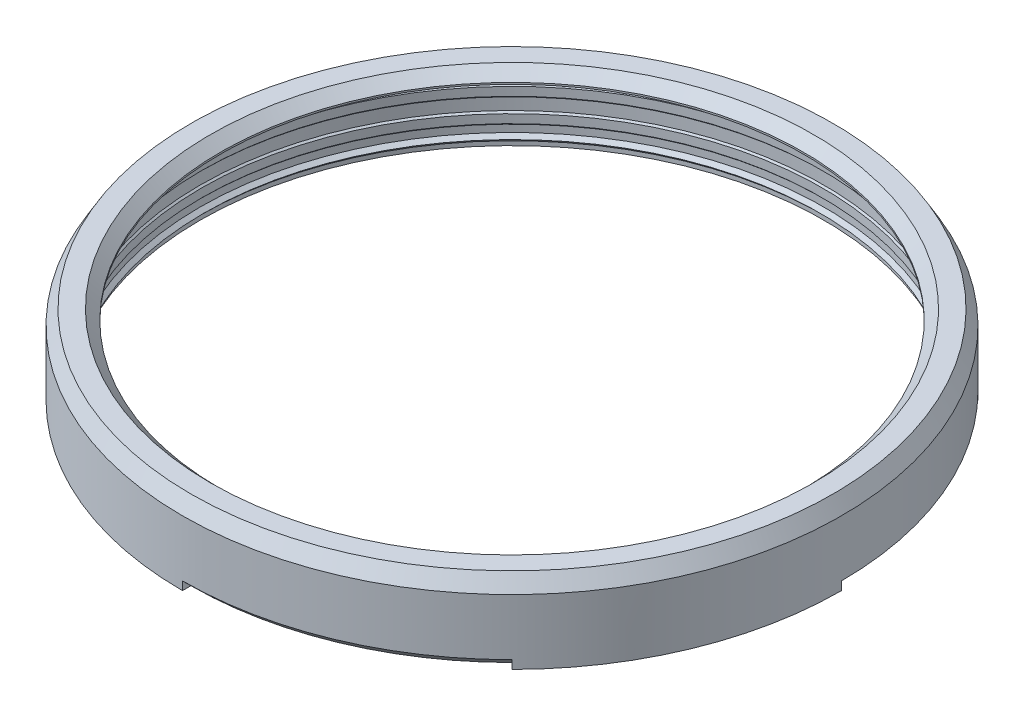
ISO-10303-21;
HEADER;
FILE_DESCRIPTION(('STEP AP214'),'2;1');
FILE_NAME('part.step','',(''),(''),'','','');
FILE_SCHEMA(('AUTOMOTIVE_DESIGN { 1 0 10303 214 1 1 1 1 }'));
ENDSEC;
DATA;
#1=APPLICATION_CONTEXT('core data for automotive mechanical design processes');
#2=APPLICATION_PROTOCOL_DEFINITION('international standard','automotive_design',2000,#1);
#3=PRODUCT_CONTEXT('',#1,'mechanical');
#4=PRODUCT('Part','Part','',(#3));
#5=PRODUCT_RELATED_PRODUCT_CATEGORY('part','',(#4));
#6=PRODUCT_DEFINITION_FORMATION('','',#4);
#7=PRODUCT_DEFINITION_CONTEXT('part definition',#1,'design');
#8=PRODUCT_DEFINITION('design','',#6,#7);
#9=PRODUCT_DEFINITION_SHAPE('','',#8);
#10=(LENGTH_UNIT() NAMED_UNIT(*) SI_UNIT(.MILLI.,.METRE.));
#11=(NAMED_UNIT(*) PLANE_ANGLE_UNIT() SI_UNIT($,.RADIAN.));
#12=(NAMED_UNIT(*) SI_UNIT($,.STERADIAN.) SOLID_ANGLE_UNIT());
#13=UNCERTAINTY_MEASURE_WITH_UNIT(LENGTH_MEASURE(1.E-05),#10,'distance_accuracy_value','');
#14=(GEOMETRIC_REPRESENTATION_CONTEXT(3) GLOBAL_UNCERTAINTY_ASSIGNED_CONTEXT((#13)) GLOBAL_UNIT_ASSIGNED_CONTEXT((#10,
#11,#12)) REPRESENTATION_CONTEXT('',''));
#15=CARTESIAN_POINT('',(0.,0.,0.));
#16=DIRECTION('',(0.,0.,1.));
#17=DIRECTION('',(1.,0.,0.));
#18=AXIS2_PLACEMENT_3D('',#15,#16,#17);
#19=CARTESIAN_POINT('',(0.,-1.39999999999983,0.));
#20=DIRECTION('',(0.,-1.,0.));
#21=DIRECTION('',(1.,0.,0.));
#22=AXIS2_PLACEMENT_3D('',#19,#20,#21);
#23=TOROIDAL_SURFACE('',#22,35.5299999999989,1.39999999999978);
#24=CARTESIAN_POINT('',(0.,-1.39999999999983,0.));
#25=DIRECTION('',(0.,-1.,0.));
#26=DIRECTION('',(1.,0.,0.));
#27=AXIS2_PLACEMENT_3D('',#24,#25,#26);
#28=CIRCLE('',#27,36.9299999999987);
#29=CARTESIAN_POINT('',(36.9299999999987,-1.39999999999983,0.));
#30=VERTEX_POINT('',#29);
#31=EDGE_CURVE('E262',#30,#30,#28,.T.);
#32=ORIENTED_EDGE('',*,*,#31,.T.);
#33=EDGE_LOOP('',(#32));
#34=FACE_BOUND('',#33,.T.);
#35=CARTESIAN_POINT('',(0.,-0.022502268604652,0.));
#36=DIRECTION('',(0.,-1.,0.));
#37=DIRECTION('',(1.,0.,0.));
#38=AXIS2_PLACEMENT_3D('',#35,#36,#37);
#39=CIRCLE('',#38,35.78);
#40=CARTESIAN_POINT('',(35.78,-0.0225022686046522,0.));
#41=VERTEX_POINT('',#40);
#42=EDGE_CURVE('E44',#41,#41,#39,.F.);
#43=ORIENTED_EDGE('',*,*,#42,.T.);
#44=EDGE_LOOP('',(#43));
#45=FACE_BOUND('',#44,.T.);
#46=ADVANCED_FACE('F39',(#34,#45),#23,.F.);
#47=CARTESIAN_POINT('',(0.,0.,0.));
#48=DIRECTION('',(0.,1.,0.));
#49=DIRECTION('',(0.,0.,1.));
#50=AXIS2_PLACEMENT_3D('',#47,#48,#49);
#51=PLANE('',#50);
#52=CARTESIAN_POINT('',(0.,0.,0.));
#53=DIRECTION('',(0.,1.,0.));
#54=DIRECTION('',(0.,0.,1.));
#55=AXIS2_PLACEMENT_3D('',#52,#53,#54);
#56=CIRCLE('',#55,34.5);
#57=CARTESIAN_POINT('',(0.,0.,34.5));
#58=VERTEX_POINT('',#57);
#59=EDGE_CURVE('E220',#58,#58,#56,.T.);
#60=ORIENTED_EDGE('',*,*,#59,.T.);
#61=EDGE_LOOP('',(#60));
#62=FACE_BOUND('',#61,.T.);
#63=CARTESIAN_POINT('',(0.,0.,0.));
#64=DIRECTION('',(0.,-1.,0.));
#65=DIRECTION('',(0.,0.,-1.));
#66=AXIS2_PLACEMENT_3D('',#63,#64,#65);
#67=CIRCLE('',#66,35.32);
#68=CARTESIAN_POINT('',(0.,0.,-35.32));
#69=VERTEX_POINT('',#68);
#70=EDGE_CURVE('E358',#69,#69,#67,.T.);
#71=ORIENTED_EDGE('',*,*,#70,.T.);
#72=EDGE_LOOP('',(#71));
#73=FACE_BOUND('',#72,.T.);
#74=ADVANCED_FACE('F293',(#62,#73),#51,.F.);
#75=CARTESIAN_POINT('',(0.,2.,0.));
#76=DIRECTION('',(0.,-1.,0.));
#77=DIRECTION('',(0.,0.,-1.));
#78=AXIS2_PLACEMENT_3D('',#75,#76,#77);
#79=CYLINDRICAL_SURFACE('',#78,39.);
#80=CARTESIAN_POINT('',(0.,-0.332000000000067,0.));
#81=DIRECTION('',(0.,1.,0.));
#82=DIRECTION('',(0.,0.,1.));
#83=AXIS2_PLACEMENT_3D('',#80,#81,#82);
#84=CIRCLE('',#83,39.);
#85=CARTESIAN_POINT('',(0.,-0.332000000000067,39.));
#86=VERTEX_POINT('',#85);
#87=EDGE_CURVE('E270',#86,#86,#84,.F.);
#88=ORIENTED_EDGE('',*,*,#87,.T.);
#89=EDGE_LOOP('',(#88));
#90=FACE_BOUND('',#89,.T.);
#91=DIRECTION('',(0.,1.,0.));
#92=VECTOR('',#91,1.);
#93=CARTESIAN_POINT('',(-27.5771644662751,-8.,-27.5771644662756));
#94=LINE('',#93,#92);
#95=CARTESIAN_POINT('',(-27.5771644662751,-8.,-27.5771644662756));
#96=VERTEX_POINT('',#95);
#97=CARTESIAN_POINT('',(-27.5771644662751,-7.,-27.5771644662756));
#98=VERTEX_POINT('',#97);
#99=EDGE_CURVE('E136',#96,#98,#94,.T.);
#100=ORIENTED_EDGE('',*,*,#99,.F.);
#101=CARTESIAN_POINT('',(0.,-8.,0.));
#102=DIRECTION('',(0.,-1.,0.));
#103=DIRECTION('',(1.,0.,0.));
#104=AXIS2_PLACEMENT_3D('',#101,#102,#103);
#105=CIRCLE('',#104,38.9999999999986);
#106=CARTESIAN_POINT('',(-38.9999999999986,-8.,0.));
#107=VERTEX_POINT('',#106);
#108=EDGE_CURVE('E325',#107,#96,#105,.T.);
#109=ORIENTED_EDGE('',*,*,#108,.F.);
#110=DIRECTION('',(0.,1.,0.));
#111=VECTOR('',#110,1.);
#112=CARTESIAN_POINT('',(-39.,-8.,0.));
#113=LINE('',#112,#111);
#114=CARTESIAN_POINT('',(-39.,-7.,0.));
#115=VERTEX_POINT('',#114);
#116=EDGE_CURVE('E64',#107,#115,#113,.T.);
#117=ORIENTED_EDGE('',*,*,#116,.T.);
#118=CARTESIAN_POINT('',(0.,-7.,0.));
#119=DIRECTION('',(0.,-1.,0.));
#120=DIRECTION('',(0.,0.,1.));
#121=AXIS2_PLACEMENT_3D('',#118,#119,#120);
#122=CIRCLE('',#121,39.);
#123=CARTESIAN_POINT('',(-27.5771644662753,-7.,27.5771644662754));
#124=VERTEX_POINT('',#123);
#125=EDGE_CURVE('E144',#124,#115,#122,.T.);
#126=ORIENTED_EDGE('',*,*,#125,.F.);
#127=DIRECTION('',(0.,1.,0.));
#128=VECTOR('',#127,1.);
#129=CARTESIAN_POINT('',(-27.5771644662753,-8.,27.5771644662754));
#130=LINE('',#129,#128);
#131=CARTESIAN_POINT('',(-27.5771644662753,-8.,27.5771644662754));
#132=VERTEX_POINT('',#131);
#133=EDGE_CURVE('E150',#132,#124,#130,.T.);
#134=ORIENTED_EDGE('',*,*,#133,.F.);
#135=CARTESIAN_POINT('',(-1.36204218666484E-13,-8.,38.9999999999986));
#136=VERTEX_POINT('',#135);
#137=EDGE_CURVE('E225',#136,#132,#105,.T.);
#138=ORIENTED_EDGE('',*,*,#137,.F.);
#139=DIRECTION('',(0.,1.,0.));
#140=VECTOR('',#139,1.);
#141=CARTESIAN_POINT('',(-1.36167772214882E-13,-8.,39.));
#142=LINE('',#141,#140);
#143=CARTESIAN_POINT('',(-1.36167772214882E-13,-7.,39.));
#144=VERTEX_POINT('',#143);
#145=EDGE_CURVE('E182',#136,#144,#142,.T.);
#146=ORIENTED_EDGE('',*,*,#145,.T.);
#147=CARTESIAN_POINT('',(0.,-7.,0.));
#148=DIRECTION('',(0.,-1.,0.));
#149=DIRECTION('',(1.,0.,0.));
#150=AXIS2_PLACEMENT_3D('',#147,#148,#149);
#151=CIRCLE('',#150,39.);
#152=CARTESIAN_POINT('',(27.5771644662753,-7.,27.5771644662754));
#153=VERTEX_POINT('',#152);
#154=EDGE_CURVE('E187',#153,#144,#151,.T.);
#155=ORIENTED_EDGE('',*,*,#154,.F.);
#156=DIRECTION('',(0.,1.,0.));
#157=VECTOR('',#156,1.);
#158=CARTESIAN_POINT('',(27.5771644662753,-8.,27.5771644662754));
#159=LINE('',#158,#157);
#160=CARTESIAN_POINT('',(27.5771644662753,-8.,27.5771644662754));
#161=VERTEX_POINT('',#160);
#162=EDGE_CURVE('E195',#161,#153,#159,.T.);
#163=ORIENTED_EDGE('',*,*,#162,.F.);
#164=CARTESIAN_POINT('',(38.9999999999986,-8.,0.));
#165=VERTEX_POINT('',#164);
#166=EDGE_CURVE('E221',#165,#161,#105,.T.);
#167=ORIENTED_EDGE('',*,*,#166,.F.);
#168=DIRECTION('',(0.,1.,0.));
#169=VECTOR('',#168,1.);
#170=CARTESIAN_POINT('',(39.,-8.,0.));
#171=LINE('',#170,#169);
#172=CARTESIAN_POINT('',(39.,-7.,0.));
#173=VERTEX_POINT('',#172);
#174=EDGE_CURVE('E201',#165,#173,#171,.T.);
#175=ORIENTED_EDGE('',*,*,#174,.T.);
#176=CARTESIAN_POINT('',(0.,-7.,0.));
#177=DIRECTION('',(0.,-1.,0.));
#178=DIRECTION('',(0.,0.,-1.));
#179=AXIS2_PLACEMENT_3D('',#176,#177,#178);
#180=CIRCLE('',#179,39.);
#181=CARTESIAN_POINT('',(27.5771644662753,-7.,-27.5771644662754));
#182=VERTEX_POINT('',#181);
#183=EDGE_CURVE('E218',#182,#173,#180,.T.);
#184=ORIENTED_EDGE('',*,*,#183,.F.);
#185=DIRECTION('',(0.,1.,0.));
#186=VECTOR('',#185,1.);
#187=CARTESIAN_POINT('',(27.5771644662753,-8.,-27.5771644662754));
#188=LINE('',#187,#186);
#189=CARTESIAN_POINT('',(27.5771644662753,-8.,-27.5771644662754));
#190=VERTEX_POINT('',#189);
#191=EDGE_CURVE('E210',#190,#182,#188,.T.);
#192=ORIENTED_EDGE('',*,*,#191,.F.);
#193=CARTESIAN_POINT('',(4.0839397728981E-13,-8.,-38.9999999999986));
#194=VERTEX_POINT('',#193);
#195=EDGE_CURVE('E226',#194,#190,#105,.T.);
#196=ORIENTED_EDGE('',*,*,#195,.F.);
#197=DIRECTION('',(0.,1.,0.));
#198=VECTOR('',#197,1.);
#199=CARTESIAN_POINT('',(4.08503316644647E-13,-8.,-39.));
#200=LINE('',#199,#198);
#201=CARTESIAN_POINT('',(4.08503316644647E-13,-7.,-39.));
#202=VERTEX_POINT('',#201);
#203=EDGE_CURVE('E56',#194,#202,#200,.T.);
#204=ORIENTED_EDGE('',*,*,#203,.T.);
#205=CARTESIAN_POINT('',(0.,-7.,0.));
#206=DIRECTION('',(0.,-1.,0.));
#207=DIRECTION('',(-1.,0.,0.));
#208=AXIS2_PLACEMENT_3D('',#205,#206,#207);
#209=CIRCLE('',#208,39.);
#210=EDGE_CURVE('E167',#98,#202,#209,.T.);
#211=ORIENTED_EDGE('',*,*,#210,.F.);
#212=EDGE_LOOP('',(#100,#109,#117,#126,#134,#138,#146,#155,#163,#167,#175,#184,#192,#196,#204,#211));
#213=FACE_BOUND('',#212,.T.);
#214=ADVANCED_FACE('F301',(#90,#213),#79,.T.);
#215=CARTESIAN_POINT('',(19.4999999999993,-8.,33.7749907475918));
#216=DIRECTION('',(0.,-1.,0.));
#217=DIRECTION('',(1.,0.,0.));
#218=AXIS2_PLACEMENT_3D('',#215,#216,#217);
#219=PLANE('',#218);
#220=CARTESIAN_POINT('',(0.,-8.,0.));
#221=DIRECTION('',(0.,-1.,0.));
#222=DIRECTION('',(1.,0.,0.));
#223=AXIS2_PLACEMENT_3D('',#220,#221,#222);
#224=CIRCLE('',#223,36.9299999999987);
#225=CARTESIAN_POINT('',(36.9299999999987,-8.,0.));
#226=VERTEX_POINT('',#225);
#227=EDGE_CURVE('E224',#226,#226,#224,.T.);
#228=ORIENTED_EDGE('',*,*,#227,.F.);
#229=EDGE_LOOP('',(#228));
#230=FACE_BOUND('',#229,.T.);
#231=ORIENTED_EDGE('',*,*,#108,.T.);
#232=DIRECTION('',(-0.707106781186541,0.,-0.707106781186554));
#233=VECTOR('',#232,1.);
#234=CARTESIAN_POINT('',(-26.8700576850886,-8.,-26.870057685089));
#235=LINE('',#234,#233);
#236=CARTESIAN_POINT('',(-26.8700576850886,-8.,-26.870057685089));
#237=VERTEX_POINT('',#236);
#238=EDGE_CURVE('E173',#237,#96,#235,.T.);
#239=ORIENTED_EDGE('',*,*,#238,.F.);
#240=CARTESIAN_POINT('',(0.,-8.,0.));
#241=DIRECTION('',(0.,-1.,0.));
#242=DIRECTION('',(-1.,0.,0.));
#243=AXIS2_PLACEMENT_3D('',#240,#241,#242);
#244=CIRCLE('',#243,38.);
#245=CARTESIAN_POINT('',(3.98028872628117E-13,-8.,-38.));
#246=VERTEX_POINT('',#245);
#247=EDGE_CURVE('E170',#237,#246,#244,.T.);
#248=ORIENTED_EDGE('',*,*,#247,.T.);
#249=DIRECTION('',(0.,0.,-1.));
#250=VECTOR('',#249,1.);
#251=CARTESIAN_POINT('',(3.98028872628117E-13,-8.,-38.));
#252=LINE('',#251,#250);
#253=EDGE_CURVE('E159',#246,#194,#252,.T.);
#254=ORIENTED_EDGE('',*,*,#253,.T.);
#255=ORIENTED_EDGE('',*,*,#195,.T.);
#256=DIRECTION('',(0.707106781186546,0.,-0.707106781186549));
#257=VECTOR('',#256,1.);
#258=CARTESIAN_POINT('',(26.8700576850888,-8.,-26.8700576850889));
#259=LINE('',#258,#257);
#260=CARTESIAN_POINT('',(26.8700576850888,-8.,-26.8700576850889));
#261=VERTEX_POINT('',#260);
#262=EDGE_CURVE('E207',#261,#190,#259,.T.);
#263=ORIENTED_EDGE('',*,*,#262,.F.);
#264=CARTESIAN_POINT('',(0.,-8.,0.));
#265=DIRECTION('',(0.,-1.,0.));
#266=DIRECTION('',(0.,0.,-1.));
#267=AXIS2_PLACEMENT_3D('',#264,#265,#266);
#268=CIRCLE('',#267,38.);
#269=CARTESIAN_POINT('',(38.,-8.,0.));
#270=VERTEX_POINT('',#269);
#271=EDGE_CURVE('E215',#261,#270,#268,.T.);
#272=ORIENTED_EDGE('',*,*,#271,.T.);
#273=DIRECTION('',(1.,0.,0.));
#274=VECTOR('',#273,1.);
#275=CARTESIAN_POINT('',(38.,-8.,0.));
#276=LINE('',#275,#274);
#277=EDGE_CURVE('E198',#270,#165,#276,.T.);
#278=ORIENTED_EDGE('',*,*,#277,.T.);
#279=ORIENTED_EDGE('',*,*,#166,.T.);
#280=DIRECTION('',(0.707106781186546,0.,0.707106781186549));
#281=VECTOR('',#280,1.);
#282=CARTESIAN_POINT('',(26.8700576850888,-8.,26.8700576850889));
#283=LINE('',#282,#281);
#284=CARTESIAN_POINT('',(26.8700576850888,-8.,26.8700576850889));
#285=VERTEX_POINT('',#284);
#286=EDGE_CURVE('E193',#285,#161,#283,.T.);
#287=ORIENTED_EDGE('',*,*,#286,.F.);
#288=CARTESIAN_POINT('',(0.,-8.,0.));
#289=DIRECTION('',(0.,-1.,0.));
#290=DIRECTION('',(1.,0.,0.));
#291=AXIS2_PLACEMENT_3D('',#288,#289,#290);
#292=CIRCLE('',#291,38.);
#293=CARTESIAN_POINT('',(-1.32676290876039E-13,-8.,38.));
#294=VERTEX_POINT('',#293);
#295=EDGE_CURVE('E190',#285,#294,#292,.T.);
#296=ORIENTED_EDGE('',*,*,#295,.T.);
#297=DIRECTION('',(0.,0.,1.));
#298=VECTOR('',#297,1.);
#299=CARTESIAN_POINT('',(-1.32676290876039E-13,-8.,38.));
#300=LINE('',#299,#298);
#301=EDGE_CURVE('E158',#294,#136,#300,.T.);
#302=ORIENTED_EDGE('',*,*,#301,.T.);
#303=ORIENTED_EDGE('',*,*,#137,.T.);
#304=DIRECTION('',(-0.707106781186546,0.,0.707106781186549));
#305=VECTOR('',#304,1.);
#306=CARTESIAN_POINT('',(-26.8700576850888,-8.,26.8700576850889));
#307=LINE('',#306,#305);
#308=CARTESIAN_POINT('',(-26.8700576850888,-8.,26.8700576850889));
#309=VERTEX_POINT('',#308);
#310=EDGE_CURVE('E148',#309,#132,#307,.T.);
#311=ORIENTED_EDGE('',*,*,#310,.F.);
#312=CARTESIAN_POINT('',(0.,-8.,0.));
#313=DIRECTION('',(0.,-1.,0.));
#314=DIRECTION('',(0.,0.,1.));
#315=AXIS2_PLACEMENT_3D('',#312,#313,#314);
#316=CIRCLE('',#315,38.);
#317=CARTESIAN_POINT('',(-38.,-8.,0.));
#318=VERTEX_POINT('',#317);
#319=EDGE_CURVE('E141',#309,#318,#316,.T.);
#320=ORIENTED_EDGE('',*,*,#319,.T.);
#321=DIRECTION('',(-1.,0.,0.));
#322=VECTOR('',#321,1.);
#323=CARTESIAN_POINT('',(-38.,-8.,0.));
#324=LINE('',#323,#322);
#325=EDGE_CURVE('E127',#318,#107,#324,.T.);
#326=ORIENTED_EDGE('',*,*,#325,.T.);
#327=EDGE_LOOP('',(#231,#239,#248,#254,#255,#263,#272,#278,#279,#287,#296,#302,#303,#311,#320,#326));
#328=FACE_BOUND('',#327,.T.);
#329=ADVANCED_FACE('F146',(#230,#328),#219,.T.);
#330=CARTESIAN_POINT('',(0.,-8.,0.));
#331=DIRECTION('',(0.,1.,0.));
#332=DIRECTION('',(0.,0.,1.));
#333=AXIS2_PLACEMENT_3D('',#330,#331,#332);
#334=CYLINDRICAL_SURFACE('',#333,34.5);
#335=CARTESIAN_POINT('',(0.,0.199999999999994,0.));
#336=DIRECTION('',(0.,1.,0.));
#337=DIRECTION('',(0.,0.,1.));
#338=AXIS2_PLACEMENT_3D('',#335,#336,#337);
#339=CIRCLE('',#338,34.5);
#340=CARTESIAN_POINT('',(0.,0.199999999999994,34.5));
#341=VERTEX_POINT('',#340);
#342=EDGE_CURVE('E11',#341,#341,#339,.T.);
#343=ORIENTED_EDGE('',*,*,#342,.T.);
#344=EDGE_LOOP('',(#343));
#345=FACE_BOUND('',#344,.T.);
#346=ORIENTED_EDGE('',*,*,#59,.F.);
#347=EDGE_LOOP('',(#346));
#348=FACE_BOUND('',#347,.T.);
#349=ADVANCED_FACE('F318',(#345,#348),#334,.F.);
#350=CARTESIAN_POINT('',(0.,0.,0.));
#351=DIRECTION('',(0.,-1.,0.));
#352=DIRECTION('',(1.,0.,0.));
#353=AXIS2_PLACEMENT_3D('',#350,#351,#352);
#354=CYLINDRICAL_SURFACE('',#353,36.9299999999987);
#355=CARTESIAN_POINT('',(0.,-1.59999999999961,0.));
#356=DIRECTION('',(0.,-1.,0.));
#357=DIRECTION('',(1.,0.,0.));
#358=AXIS2_PLACEMENT_3D('',#355,#356,#357);
#359=CIRCLE('',#358,36.9299999999987);
#360=CARTESIAN_POINT('',(36.9299999999987,-1.59999999999961,0.));
#361=VERTEX_POINT('',#360);
#362=EDGE_CURVE('E259',#361,#361,#359,.T.);
#363=ORIENTED_EDGE('',*,*,#362,.T.);
#364=EDGE_LOOP('',(#363));
#365=FACE_BOUND('',#364,.T.);
#366=ORIENTED_EDGE('',*,*,#31,.F.);
#367=EDGE_LOOP('',(#366));
#368=FACE_BOUND('',#367,.T.);
#369=ADVANCED_FACE('F306',(#365,#368),#354,.F.);
#370=CARTESIAN_POINT('',(0.,-1.59999999999961,0.));
#371=DIRECTION('',(0.,1.,0.));
#372=DIRECTION('',(-1.,0.,0.));
#373=AXIS2_PLACEMENT_3D('',#370,#371,#372);
#374=CONICAL_SURFACE('',#373,36.9299999999987,0.785398163397394);
#375=CARTESIAN_POINT('',(0.,-1.78999999999965,0.));
#376=DIRECTION('',(0.,-1.,0.));
#377=DIRECTION('',(1.,0.,0.));
#378=AXIS2_PLACEMENT_3D('',#375,#376,#377);
#379=CIRCLE('',#378,36.7399999999987);
#380=CARTESIAN_POINT('',(36.7399999999987,-1.78999999999966,0.));
#381=VERTEX_POINT('',#380);
#382=EDGE_CURVE('E256',#381,#381,#379,.T.);
#383=ORIENTED_EDGE('',*,*,#382,.T.);
#384=EDGE_LOOP('',(#383));
#385=FACE_BOUND('',#384,.T.);
#386=ORIENTED_EDGE('',*,*,#362,.F.);
#387=EDGE_LOOP('',(#386));
#388=FACE_BOUND('',#387,.T.);
#389=ADVANCED_FACE('F448',(#385,#388),#374,.F.);
#390=CARTESIAN_POINT('',(0.,0.,0.));
#391=DIRECTION('',(0.,-1.,0.));
#392=DIRECTION('',(1.,0.,0.));
#393=AXIS2_PLACEMENT_3D('',#390,#391,#392);
#394=CYLINDRICAL_SURFACE('',#393,36.7399999999987);
#395=CARTESIAN_POINT('',(0.,-2.80999999999967,0.));
#396=DIRECTION('',(0.,-1.,0.));
#397=DIRECTION('',(1.,0.,0.));
#398=AXIS2_PLACEMENT_3D('',#395,#396,#397);
#399=CIRCLE('',#398,36.7399999999987);
#400=CARTESIAN_POINT('',(36.7399999999987,-2.80999999999967,0.));
#401=VERTEX_POINT('',#400);
#402=EDGE_CURVE('E253',#401,#401,#399,.T.);
#403=ORIENTED_EDGE('',*,*,#402,.T.);
#404=EDGE_LOOP('',(#403));
#405=FACE_BOUND('',#404,.T.);
#406=ORIENTED_EDGE('',*,*,#382,.F.);
#407=EDGE_LOOP('',(#406));
#408=FACE_BOUND('',#407,.T.);
#409=ADVANCED_FACE('F445',(#405,#408),#394,.F.);
#410=CARTESIAN_POINT('',(0.,-2.80999999999967,0.));
#411=DIRECTION('',(0.,-1.,0.));
#412=DIRECTION('',(1.,0.,0.));
#413=AXIS2_PLACEMENT_3D('',#410,#411,#412);
#414=CONICAL_SURFACE('',#413,36.7399999999987,0.785398163397484);
#415=CARTESIAN_POINT('',(0.,-2.99999999999966,0.));
#416=DIRECTION('',(0.,-1.,0.));
#417=DIRECTION('',(1.,0.,0.));
#418=AXIS2_PLACEMENT_3D('',#415,#416,#417);
#419=CIRCLE('',#418,36.9299999999987);
#420=CARTESIAN_POINT('',(36.9299999999987,-2.99999999999966,0.));
#421=VERTEX_POINT('',#420);
#422=EDGE_CURVE('E250',#421,#421,#419,.T.);
#423=ORIENTED_EDGE('',*,*,#422,.T.);
#424=EDGE_LOOP('',(#423));
#425=FACE_BOUND('',#424,.T.);
#426=ORIENTED_EDGE('',*,*,#402,.F.);
#427=EDGE_LOOP('',(#426));
#428=FACE_BOUND('',#427,.T.);
#429=ADVANCED_FACE('F441',(#425,#428),#414,.F.);
#430=CARTESIAN_POINT('',(0.,0.,0.));
#431=DIRECTION('',(0.,-1.,0.));
#432=DIRECTION('',(1.,0.,0.));
#433=AXIS2_PLACEMENT_3D('',#430,#431,#432);
#434=CYLINDRICAL_SURFACE('',#433,36.9299999999987);
#435=CARTESIAN_POINT('',(0.,-4.39999999999965,0.));
#436=DIRECTION('',(0.,-1.,0.));
#437=DIRECTION('',(1.,0.,0.));
#438=AXIS2_PLACEMENT_3D('',#435,#436,#437);
#439=CIRCLE('',#438,36.9299999999987);
#440=CARTESIAN_POINT('',(36.9299999999987,-4.39999999999965,0.));
#441=VERTEX_POINT('',#440);
#442=EDGE_CURVE('E247',#441,#441,#439,.T.);
#443=ORIENTED_EDGE('',*,*,#442,.T.);
#444=EDGE_LOOP('',(#443));
#445=FACE_BOUND('',#444,.T.);
#446=ORIENTED_EDGE('',*,*,#422,.F.);
#447=EDGE_LOOP('',(#446));
#448=FACE_BOUND('',#447,.T.);
#449=ADVANCED_FACE('F437',(#445,#448),#434,.F.);
#450=CARTESIAN_POINT('',(0.,-4.39999999999965,0.));
#451=DIRECTION('',(0.,1.,0.));
#452=DIRECTION('',(-1.,0.,0.));
#453=AXIS2_PLACEMENT_3D('',#450,#451,#452);
#454=CONICAL_SURFACE('',#453,36.9299999999987,0.785398163397371);
#455=CARTESIAN_POINT('',(0.,-4.5899999999997,0.));
#456=DIRECTION('',(0.,-1.,0.));
#457=DIRECTION('',(1.,0.,0.));
#458=AXIS2_PLACEMENT_3D('',#455,#456,#457);
#459=CIRCLE('',#458,36.7399999999987);
#460=CARTESIAN_POINT('',(36.7399999999987,-4.5899999999997,0.));
#461=VERTEX_POINT('',#460);
#462=EDGE_CURVE('E244',#461,#461,#459,.T.);
#463=ORIENTED_EDGE('',*,*,#462,.T.);
#464=EDGE_LOOP('',(#463));
#465=FACE_BOUND('',#464,.T.);
#466=ORIENTED_EDGE('',*,*,#442,.F.);
#467=EDGE_LOOP('',(#466));
#468=FACE_BOUND('',#467,.T.);
#469=ADVANCED_FACE('F433',(#465,#468),#454,.F.);
#470=CARTESIAN_POINT('',(0.,0.,0.));
#471=DIRECTION('',(0.,-1.,0.));
#472=DIRECTION('',(1.,0.,0.));
#473=AXIS2_PLACEMENT_3D('',#470,#471,#472);
#474=CYLINDRICAL_SURFACE('',#473,36.7399999999987);
#475=CARTESIAN_POINT('',(0.,-5.60999999999966,0.));
#476=DIRECTION('',(0.,-1.,0.));
#477=DIRECTION('',(1.,0.,0.));
#478=AXIS2_PLACEMENT_3D('',#475,#476,#477);
#479=CIRCLE('',#478,36.7399999999987);
#480=CARTESIAN_POINT('',(36.7399999999987,-5.60999999999966,0.));
#481=VERTEX_POINT('',#480);
#482=EDGE_CURVE('E241',#481,#481,#479,.T.);
#483=ORIENTED_EDGE('',*,*,#482,.T.);
#484=EDGE_LOOP('',(#483));
#485=FACE_BOUND('',#484,.T.);
#486=ORIENTED_EDGE('',*,*,#462,.F.);
#487=EDGE_LOOP('',(#486));
#488=FACE_BOUND('',#487,.T.);
#489=ADVANCED_FACE('F429',(#485,#488),#474,.F.);
#490=CARTESIAN_POINT('',(0.,-5.60999999999966,0.));
#491=DIRECTION('',(0.,-1.,0.));
#492=DIRECTION('',(1.,0.,0.));
#493=AXIS2_PLACEMENT_3D('',#490,#491,#492);
#494=CONICAL_SURFACE('',#493,36.7399999999987,0.785398163397505);
#495=CARTESIAN_POINT('',(0.,-5.79999999999967,0.));
#496=DIRECTION('',(0.,-1.,0.));
#497=DIRECTION('',(1.,0.,0.));
#498=AXIS2_PLACEMENT_3D('',#495,#496,#497);
#499=CIRCLE('',#498,36.9299999999987);
#500=CARTESIAN_POINT('',(36.9299999999987,-5.79999999999967,0.));
#501=VERTEX_POINT('',#500);
#502=EDGE_CURVE('E238',#501,#501,#499,.T.);
#503=ORIENTED_EDGE('',*,*,#502,.T.);
#504=EDGE_LOOP('',(#503));
#505=FACE_BOUND('',#504,.T.);
#506=ORIENTED_EDGE('',*,*,#482,.F.);
#507=EDGE_LOOP('',(#506));
#508=FACE_BOUND('',#507,.T.);
#509=ADVANCED_FACE('F425',(#505,#508),#494,.F.);
#510=CARTESIAN_POINT('',(0.,0.,0.));
#511=DIRECTION('',(0.,-1.,0.));
#512=DIRECTION('',(1.,0.,0.));
#513=AXIS2_PLACEMENT_3D('',#510,#511,#512);
#514=CYLINDRICAL_SURFACE('',#513,36.9299999999987);
#515=CARTESIAN_POINT('',(0.,-6.64999999999967,0.));
#516=DIRECTION('',(0.,-1.,0.));
#517=DIRECTION('',(1.,0.,0.));
#518=AXIS2_PLACEMENT_3D('',#515,#516,#517);
#519=CIRCLE('',#518,36.9299999999987);
#520=CARTESIAN_POINT('',(36.9299999999987,-6.64999999999967,0.));
#521=VERTEX_POINT('',#520);
#522=EDGE_CURVE('E235',#521,#521,#519,.T.);
#523=ORIENTED_EDGE('',*,*,#522,.T.);
#524=EDGE_LOOP('',(#523));
#525=FACE_BOUND('',#524,.T.);
#526=ORIENTED_EDGE('',*,*,#502,.F.);
#527=EDGE_LOOP('',(#526));
#528=FACE_BOUND('',#527,.T.);
#529=ADVANCED_FACE('F421',(#525,#528),#514,.F.);
#530=CARTESIAN_POINT('',(0.,-6.64999999999967,0.));
#531=DIRECTION('',(0.,1.,0.));
#532=DIRECTION('',(-1.,0.,0.));
#533=AXIS2_PLACEMENT_3D('',#530,#531,#532);
#534=CONICAL_SURFACE('',#533,36.9299999999987,0.78539816339737);
#535=CARTESIAN_POINT('',(0.,-7.07499999999987,0.));
#536=DIRECTION('',(0.,-1.,0.));
#537=DIRECTION('',(1.,0.,0.));
#538=AXIS2_PLACEMENT_3D('',#535,#536,#537);
#539=CIRCLE('',#538,36.5049999999986);
#540=CARTESIAN_POINT('',(36.5049999999986,-7.07499999999987,0.));
#541=VERTEX_POINT('',#540);
#542=EDGE_CURVE('E232',#541,#541,#539,.T.);
#543=ORIENTED_EDGE('',*,*,#542,.T.);
#544=EDGE_LOOP('',(#543));
#545=FACE_BOUND('',#544,.T.);
#546=ORIENTED_EDGE('',*,*,#522,.F.);
#547=EDGE_LOOP('',(#546));
#548=FACE_BOUND('',#547,.T.);
#549=ADVANCED_FACE('F417',(#545,#548),#534,.F.);
#550=CARTESIAN_POINT('',(0.,-7.07499999999987,0.));
#551=DIRECTION('',(0.,-1.,0.));
#552=DIRECTION('',(1.,0.,0.));
#553=AXIS2_PLACEMENT_3D('',#550,#551,#552);
#554=CONICAL_SURFACE('',#553,36.5049999999986,0.785398163397486);
#555=CARTESIAN_POINT('',(0.,-7.49999999999999,0.));
#556=DIRECTION('',(0.,-1.,0.));
#557=DIRECTION('',(1.,0.,0.));
#558=AXIS2_PLACEMENT_3D('',#555,#556,#557);
#559=CIRCLE('',#558,36.9299999999987);
#560=CARTESIAN_POINT('',(36.9299999999987,-7.49999999999999,0.));
#561=VERTEX_POINT('',#560);
#562=EDGE_CURVE('E229',#561,#561,#559,.T.);
#563=ORIENTED_EDGE('',*,*,#562,.T.);
#564=EDGE_LOOP('',(#563));
#565=FACE_BOUND('',#564,.T.);
#566=ORIENTED_EDGE('',*,*,#542,.F.);
#567=EDGE_LOOP('',(#566));
#568=FACE_BOUND('',#567,.T.);
#569=ADVANCED_FACE('F413',(#565,#568),#554,.F.);
#570=CARTESIAN_POINT('',(0.,0.,0.));
#571=DIRECTION('',(0.,-1.,0.));
#572=DIRECTION('',(1.,0.,0.));
#573=AXIS2_PLACEMENT_3D('',#570,#571,#572);
#574=CYLINDRICAL_SURFACE('',#573,36.9299999999987);
#575=ORIENTED_EDGE('',*,*,#227,.T.);
#576=EDGE_LOOP('',(#575));
#577=FACE_BOUND('',#576,.T.);
#578=ORIENTED_EDGE('',*,*,#562,.F.);
#579=EDGE_LOOP('',(#578));
#580=FACE_BOUND('',#579,.T.);
#581=ADVANCED_FACE('F407',(#577,#580),#574,.F.);
#582=CARTESIAN_POINT('',(0.,1.4,0.));
#583=DIRECTION('',(0.,1.,0.));
#584=DIRECTION('',(0.,0.,1.));
#585=AXIS2_PLACEMENT_3D('',#582,#583,#584);
#586=PLANE('',#585);
#587=CARTESIAN_POINT('',(0.,1.4,0.));
#588=DIRECTION('',(0.,1.,0.));
#589=DIRECTION('',(0.,0.,1.));
#590=AXIS2_PLACEMENT_3D('',#587,#588,#589);
#591=CIRCLE('',#590,35.7);
#592=CARTESIAN_POINT('',(0.,1.4,35.7));
#593=VERTEX_POINT('',#592);
#594=EDGE_CURVE('E49',#593,#593,#591,.F.);
#595=ORIENTED_EDGE('',*,*,#594,.T.);
#596=EDGE_LOOP('',(#595));
#597=FACE_BOUND('',#596,.T.);
#598=CARTESIAN_POINT('',(0.,1.4,0.));
#599=DIRECTION('',(0.,1.,0.));
#600=DIRECTION('',(0.,0.,1.));
#601=AXIS2_PLACEMENT_3D('',#598,#599,#600);
#602=CIRCLE('',#601,38.0000293337635);
#603=CARTESIAN_POINT('',(0.,1.4,38.0000293337635));
#604=VERTEX_POINT('',#603);
#605=EDGE_CURVE('E265',#604,#604,#602,.T.);
#606=ORIENTED_EDGE('',*,*,#605,.T.);
#607=EDGE_LOOP('',(#606));
#608=FACE_BOUND('',#607,.T.);
#609=ADVANCED_FACE('F276',(#597,#608),#586,.T.);
#610=CARTESIAN_POINT('',(0.,1.4,0.));
#611=DIRECTION('',(0.,-1.,0.));
#612=DIRECTION('',(0.,0.,-1.));
#613=AXIS2_PLACEMENT_3D('',#610,#611,#612);
#614=CONICAL_SURFACE('',#613,38.0000293337635,0.523598775598296);
#615=ORIENTED_EDGE('',*,*,#87,.F.);
#616=EDGE_LOOP('',(#615));
#617=FACE_BOUND('',#616,.T.);
#618=ORIENTED_EDGE('',*,*,#605,.F.);
#619=EDGE_LOOP('',(#618));
#620=FACE_BOUND('',#619,.T.);
#621=ADVANCED_FACE('F281',(#617,#620),#614,.T.);
#622=CARTESIAN_POINT('',(0.,1.4,0.));
#623=DIRECTION('',(0.,1.,0.));
#624=DIRECTION('',(0.,0.,1.));
#625=AXIS2_PLACEMENT_3D('',#622,#623,#624);
#626=CONICAL_SURFACE('',#625,35.7,0.78539816339744);
#627=ORIENTED_EDGE('',*,*,#342,.F.);
#628=EDGE_LOOP('',(#627));
#629=FACE_BOUND('',#628,.T.);
#630=ORIENTED_EDGE('',*,*,#594,.F.);
#631=EDGE_LOOP('',(#630));
#632=FACE_BOUND('',#631,.T.);
#633=ADVANCED_FACE('F42',(#629,#632),#626,.F.);
#634=CARTESIAN_POINT('',(0.,-7.,0.));
#635=DIRECTION('',(0.,1.,0.));
#636=DIRECTION('',(0.,0.,1.));
#637=AXIS2_PLACEMENT_3D('',#634,#635,#636);
#638=CONICAL_SURFACE('',#637,39.,0.785398163397445);
#639=DIRECTION('',(-0.499999999999998,-0.70710678118655,0.499999999999999));
#640=VECTOR('',#639,1.);
#641=CARTESIAN_POINT('',(27.5771644662753,-7.,-27.5771644662754));
#642=LINE('',#641,#640);
#643=EDGE_CURVE('E212',#182,#261,#642,.T.);
#644=ORIENTED_EDGE('',*,*,#643,.F.);
#645=ORIENTED_EDGE('',*,*,#183,.T.);
#646=DIRECTION('',(-0.707106781186545,-0.70710678118655,0.));
#647=VECTOR('',#646,1.);
#648=CARTESIAN_POINT('',(39.,-7.,0.));
#649=LINE('',#648,#647);
#650=EDGE_CURVE('E204',#173,#270,#649,.T.);
#651=ORIENTED_EDGE('',*,*,#650,.T.);
#652=ORIENTED_EDGE('',*,*,#271,.F.);
#653=EDGE_LOOP('',(#644,#645,#651,#652));
#654=FACE_BOUND('',#653,.T.);
#655=ADVANCED_FACE('F280',(#654),#638,.T.);
#656=CARTESIAN_POINT('',(0.,0.,0.));
#657=DIRECTION('',(0.707106781186549,0.,0.707106781186546));
#658=DIRECTION('',(0.707106781186546,0.,-0.707106781186549));
#659=AXIS2_PLACEMENT_3D('',#656,#657,#658);
#660=PLANE('',#659);
#661=ORIENTED_EDGE('',*,*,#262,.T.);
#662=ORIENTED_EDGE('',*,*,#191,.T.);
#663=ORIENTED_EDGE('',*,*,#643,.T.);
#664=EDGE_LOOP('',(#661,#662,#663));
#665=FACE_BOUND('',#664,.T.);
#666=ADVANCED_FACE('F287',(#665),#660,.T.);
#667=CARTESIAN_POINT('',(0.,0.,0.));
#668=DIRECTION('',(0.,0.,1.));
#669=DIRECTION('',(1.,0.,0.));
#670=AXIS2_PLACEMENT_3D('',#667,#668,#669);
#671=PLANE('',#670);
#672=ORIENTED_EDGE('',*,*,#277,.F.);
#673=ORIENTED_EDGE('',*,*,#650,.F.);
#674=ORIENTED_EDGE('',*,*,#174,.F.);
#675=EDGE_LOOP('',(#672,#673,#674));
#676=FACE_BOUND('',#675,.T.);
#677=ADVANCED_FACE('F337',(#676),#671,.F.);
#678=CARTESIAN_POINT('',(0.,0.,0.));
#679=DIRECTION('',(-0.707106781186549,0.,0.707106781186546));
#680=DIRECTION('',(0.707106781186546,0.,0.707106781186549));
#681=AXIS2_PLACEMENT_3D('',#678,#679,#680);
#682=PLANE('',#681);
#683=ORIENTED_EDGE('',*,*,#286,.T.);
#684=ORIENTED_EDGE('',*,*,#162,.T.);
#685=DIRECTION('',(-0.499999999999998,-0.70710678118655,-0.499999999999999));
#686=VECTOR('',#685,1.);
#687=CARTESIAN_POINT('',(27.5771644662753,-7.,27.5771644662754));
#688=LINE('',#687,#686);
#689=EDGE_CURVE('E185',#153,#285,#688,.T.);
#690=ORIENTED_EDGE('',*,*,#689,.T.);
#691=EDGE_LOOP('',(#683,#684,#690));
#692=FACE_BOUND('',#691,.T.);
#693=ADVANCED_FACE('F342',(#692),#682,.T.);
#694=CARTESIAN_POINT('',(0.,-7.,0.));
#695=DIRECTION('',(0.,1.,0.));
#696=DIRECTION('',(-1.,0.,0.));
#697=AXIS2_PLACEMENT_3D('',#694,#695,#696);
#698=CONICAL_SURFACE('',#697,39.,0.785398163397445);
#699=ORIENTED_EDGE('',*,*,#689,.F.);
#700=ORIENTED_EDGE('',*,*,#154,.T.);
#701=DIRECTION('',(0.,-0.70710678118655,-0.707106781186545));
#702=VECTOR('',#701,1.);
#703=CARTESIAN_POINT('',(-1.36167772214882E-13,-7.,39.));
#704=LINE('',#703,#702);
#705=EDGE_CURVE('E179',#144,#294,#704,.T.);
#706=ORIENTED_EDGE('',*,*,#705,.T.);
#707=ORIENTED_EDGE('',*,*,#295,.F.);
#708=EDGE_LOOP('',(#699,#700,#706,#707));
#709=FACE_BOUND('',#708,.T.);
#710=ADVANCED_FACE('F346',(#709),#698,.T.);
#711=CARTESIAN_POINT('',(0.,0.,0.));
#712=DIRECTION('',(-1.,0.,0.));
#713=DIRECTION('',(0.,0.,1.));
#714=AXIS2_PLACEMENT_3D('',#711,#712,#713);
#715=PLANE('',#714);
#716=ORIENTED_EDGE('',*,*,#301,.F.);
#717=ORIENTED_EDGE('',*,*,#705,.F.);
#718=ORIENTED_EDGE('',*,*,#145,.F.);
#719=EDGE_LOOP('',(#716,#717,#718));
#720=FACE_BOUND('',#719,.T.);
#721=ADVANCED_FACE('F348',(#720),#715,.F.);
#722=CARTESIAN_POINT('',(0.,0.,0.));
#723=DIRECTION('',(-0.707106781186549,0.,-0.707106781186546));
#724=DIRECTION('',(-0.707106781186546,0.,0.707106781186549));
#725=AXIS2_PLACEMENT_3D('',#722,#723,#724);
#726=PLANE('',#725);
#727=ORIENTED_EDGE('',*,*,#310,.T.);
#728=ORIENTED_EDGE('',*,*,#133,.T.);
#729=DIRECTION('',(0.499999999999998,-0.70710678118655,-0.499999999999999));
#730=VECTOR('',#729,1.);
#731=CARTESIAN_POINT('',(-27.5771644662753,-7.,27.5771644662754));
#732=LINE('',#731,#730);
#733=EDGE_CURVE('E152',#124,#309,#732,.T.);
#734=ORIENTED_EDGE('',*,*,#733,.T.);
#735=EDGE_LOOP('',(#727,#728,#734));
#736=FACE_BOUND('',#735,.T.);
#737=ADVANCED_FACE('F351',(#736),#726,.T.);
#738=CARTESIAN_POINT('',(0.,-7.,0.));
#739=DIRECTION('',(0.,1.,0.));
#740=DIRECTION('',(0.,0.,-1.));
#741=AXIS2_PLACEMENT_3D('',#738,#739,#740);
#742=CONICAL_SURFACE('',#741,39.,0.785398163397445);
#743=ORIENTED_EDGE('',*,*,#733,.F.);
#744=ORIENTED_EDGE('',*,*,#125,.T.);
#745=DIRECTION('',(0.707106781186545,-0.70710678118655,0.));
#746=VECTOR('',#745,1.);
#747=CARTESIAN_POINT('',(-39.,-7.,0.));
#748=LINE('',#747,#746);
#749=EDGE_CURVE('E130',#115,#318,#748,.T.);
#750=ORIENTED_EDGE('',*,*,#749,.T.);
#751=ORIENTED_EDGE('',*,*,#319,.F.);
#752=EDGE_LOOP('',(#743,#744,#750,#751));
#753=FACE_BOUND('',#752,.T.);
#754=ADVANCED_FACE('F140',(#753),#742,.T.);
#755=CARTESIAN_POINT('',(0.,0.,0.));
#756=DIRECTION('',(0.,0.,-1.));
#757=DIRECTION('',(-1.,0.,0.));
#758=AXIS2_PLACEMENT_3D('',#755,#756,#757);
#759=PLANE('',#758);
#760=ORIENTED_EDGE('',*,*,#325,.F.);
#761=ORIENTED_EDGE('',*,*,#749,.F.);
#762=ORIENTED_EDGE('',*,*,#116,.F.);
#763=EDGE_LOOP('',(#760,#761,#762));
#764=FACE_BOUND('',#763,.T.);
#765=ADVANCED_FACE('F129',(#764),#759,.F.);
#766=CARTESIAN_POINT('',(0.,0.,0.));
#767=DIRECTION('',(0.707106781186554,0.,-0.707106781186541));
#768=DIRECTION('',(-0.707106781186541,0.,-0.707106781186554));
#769=AXIS2_PLACEMENT_3D('',#766,#767,#768);
#770=PLANE('',#769);
#771=ORIENTED_EDGE('',*,*,#238,.T.);
#772=ORIENTED_EDGE('',*,*,#99,.T.);
#773=DIRECTION('',(0.499999999999994,-0.70710678118655,0.500000000000003));
#774=VECTOR('',#773,1.);
#775=CARTESIAN_POINT('',(-27.5771644662751,-7.,-27.5771644662756));
#776=LINE('',#775,#774);
#777=EDGE_CURVE('E165',#98,#237,#776,.T.);
#778=ORIENTED_EDGE('',*,*,#777,.T.);
#779=EDGE_LOOP('',(#771,#772,#778));
#780=FACE_BOUND('',#779,.T.);
#781=ADVANCED_FACE('F385',(#780),#770,.T.);
#782=CARTESIAN_POINT('',(0.,-7.,0.));
#783=DIRECTION('',(0.,1.,0.));
#784=DIRECTION('',(1.,0.,0.));
#785=AXIS2_PLACEMENT_3D('',#782,#783,#784);
#786=CONICAL_SURFACE('',#785,39.,0.785398163397445);
#787=ORIENTED_EDGE('',*,*,#777,.F.);
#788=ORIENTED_EDGE('',*,*,#210,.T.);
#789=DIRECTION('',(0.,-0.70710678118655,0.707106781186545));
#790=VECTOR('',#789,1.);
#791=CARTESIAN_POINT('',(4.08503316644647E-13,-7.,-39.));
#792=LINE('',#791,#790);
#793=EDGE_CURVE('E161',#202,#246,#792,.T.);
#794=ORIENTED_EDGE('',*,*,#793,.T.);
#795=ORIENTED_EDGE('',*,*,#247,.F.);
#796=EDGE_LOOP('',(#787,#788,#794,#795));
#797=FACE_BOUND('',#796,.T.);
#798=ADVANCED_FACE('F379',(#797),#786,.T.);
#799=CARTESIAN_POINT('',(0.,0.,0.));
#800=DIRECTION('',(1.,0.,0.));
#801=DIRECTION('',(0.,0.,-1.));
#802=AXIS2_PLACEMENT_3D('',#799,#800,#801);
#803=PLANE('',#802);
#804=ORIENTED_EDGE('',*,*,#253,.F.);
#805=ORIENTED_EDGE('',*,*,#793,.F.);
#806=ORIENTED_EDGE('',*,*,#203,.F.);
#807=EDGE_LOOP('',(#804,#805,#806));
#808=FACE_BOUND('',#807,.T.);
#809=ADVANCED_FACE('F370',(#808),#803,.F.);
#810=CARTESIAN_POINT('',(0.,-0.5,0.));
#811=DIRECTION('',(0.,-1.,0.));
#812=DIRECTION('',(0.,0.,-1.));
#813=AXIS2_PLACEMENT_3D('',#810,#811,#812);
#814=PLANE('',#813);
#815=CARTESIAN_POINT('',(0.,-0.5,0.));
#816=DIRECTION('',(0.,-1.,0.));
#817=DIRECTION('',(0.,0.,-1.));
#818=AXIS2_PLACEMENT_3D('',#815,#816,#817);
#819=CIRCLE('',#818,35.78);
#820=CARTESIAN_POINT('',(0.,-0.5,-35.78));
#821=VERTEX_POINT('',#820);
#822=EDGE_CURVE('E354',#821,#821,#819,.T.);
#823=ORIENTED_EDGE('',*,*,#822,.T.);
#824=EDGE_LOOP('',(#823));
#825=FACE_BOUND('',#824,.T.);
#826=CARTESIAN_POINT('',(0.,-0.5,0.));
#827=DIRECTION('',(0.,-1.,0.));
#828=DIRECTION('',(0.,0.,-1.));
#829=AXIS2_PLACEMENT_3D('',#826,#827,#828);
#830=CIRCLE('',#829,35.32);
#831=CARTESIAN_POINT('',(0.,-0.5,-35.32));
#832=VERTEX_POINT('',#831);
#833=EDGE_CURVE('E357',#832,#832,#830,.T.);
#834=ORIENTED_EDGE('',*,*,#833,.F.);
#835=EDGE_LOOP('',(#834));
#836=FACE_BOUND('',#835,.T.);
#837=ADVANCED_FACE('F367',(#825,#836),#814,.T.);
#838=CARTESIAN_POINT('',(0.,-0.5,0.));
#839=DIRECTION('',(0.,1.,0.));
#840=DIRECTION('',(0.,0.,1.));
#841=AXIS2_PLACEMENT_3D('',#838,#839,#840);
#842=CYLINDRICAL_SURFACE('',#841,35.78);
#843=ORIENTED_EDGE('',*,*,#42,.F.);
#844=EDGE_LOOP('',(#843));
#845=FACE_BOUND('',#844,.T.);
#846=ORIENTED_EDGE('',*,*,#822,.F.);
#847=EDGE_LOOP('',(#846));
#848=FACE_BOUND('',#847,.T.);
#849=ADVANCED_FACE('F369',(#845,#848),#842,.T.);
#850=CARTESIAN_POINT('',(0.,-0.5,0.));
#851=DIRECTION('',(0.,1.,0.));
#852=DIRECTION('',(0.,0.,1.));
#853=AXIS2_PLACEMENT_3D('',#850,#851,#852);
#854=CYLINDRICAL_SURFACE('',#853,35.32);
#855=ORIENTED_EDGE('',*,*,#833,.T.);
#856=EDGE_LOOP('',(#855));
#857=FACE_BOUND('',#856,.T.);
#858=ORIENTED_EDGE('',*,*,#70,.F.);
#859=EDGE_LOOP('',(#858));
#860=FACE_BOUND('',#859,.T.);
#861=ADVANCED_FACE('F364',(#857,#860),#854,.F.);
#862=CLOSED_SHELL('',(#46,#74,#214,#329,#349,#369,#389,#409,#429,#449,#469,#489,#509,#529,#549,
#569,#581,#609,#621,#633,#655,#666,#677,#693,#710,#721,#737,#754,#765,#781,#798,#809,#837,#849,#861));
#863=MANIFOLD_SOLID_BREP('B2',#862);
#864=ADVANCED_BREP_SHAPE_REPRESENTATION('',(#18,#863),#14);
#865=SHAPE_DEFINITION_REPRESENTATION(#9,#864);
ENDSEC;
END-ISO-10303-21;
